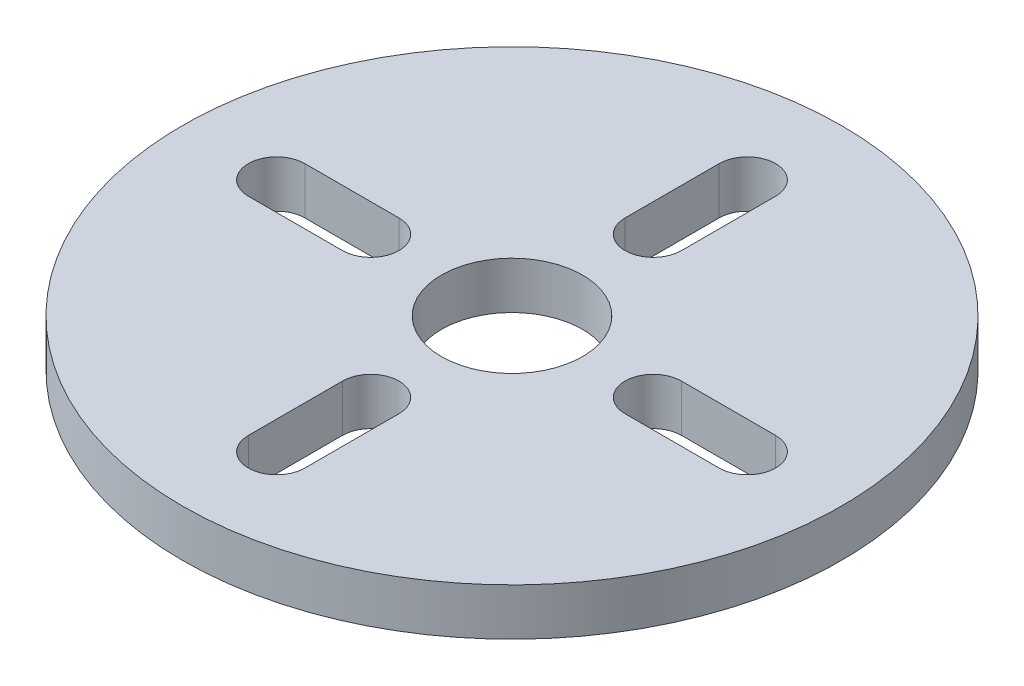
ISO-10303-21;
HEADER;
FILE_DESCRIPTION(('STEP AP214'),'2;1');
FILE_NAME('part.step','',(''),(''),'','','');
FILE_SCHEMA(('AUTOMOTIVE_DESIGN { 1 0 10303 214 1 1 1 1 }'));
ENDSEC;
DATA;
#1=APPLICATION_CONTEXT('core data for automotive mechanical design processes');
#2=APPLICATION_PROTOCOL_DEFINITION('international standard','automotive_design',2000,#1);
#3=PRODUCT_CONTEXT('',#1,'mechanical');
#4=PRODUCT('Part','Part','',(#3));
#5=PRODUCT_RELATED_PRODUCT_CATEGORY('part','',(#4));
#6=PRODUCT_DEFINITION_FORMATION('','',#4);
#7=PRODUCT_DEFINITION_CONTEXT('part definition',#1,'design');
#8=PRODUCT_DEFINITION('design','',#6,#7);
#9=PRODUCT_DEFINITION_SHAPE('','',#8);
#10=(LENGTH_UNIT() NAMED_UNIT(*) SI_UNIT(.MILLI.,.METRE.));
#11=(NAMED_UNIT(*) PLANE_ANGLE_UNIT() SI_UNIT($,.RADIAN.));
#12=(NAMED_UNIT(*) SI_UNIT($,.STERADIAN.) SOLID_ANGLE_UNIT());
#13=UNCERTAINTY_MEASURE_WITH_UNIT(LENGTH_MEASURE(1.E-05),#10,'distance_accuracy_value','');
#14=(GEOMETRIC_REPRESENTATION_CONTEXT(3) GLOBAL_UNCERTAINTY_ASSIGNED_CONTEXT((#13)) GLOBAL_UNIT_ASSIGNED_CONTEXT((#10,
#11,#12)) REPRESENTATION_CONTEXT('',''));
#15=CARTESIAN_POINT('',(0.,0.,0.));
#16=DIRECTION('',(0.,0.,1.));
#17=DIRECTION('',(1.,0.,0.));
#18=AXIS2_PLACEMENT_3D('',#15,#16,#17);
#19=CARTESIAN_POINT('',(0.,2.,0.));
#20=DIRECTION('',(0.,-1.,0.));
#21=DIRECTION('',(0.,0.,-1.));
#22=AXIS2_PLACEMENT_3D('',#19,#20,#21);
#23=CYLINDRICAL_SURFACE('',#22,14.);
#24=CARTESIAN_POINT('',(0.,2.,0.));
#25=DIRECTION('',(0.,1.,0.));
#26=DIRECTION('',(0.,0.,1.));
#27=AXIS2_PLACEMENT_3D('',#24,#25,#26);
#28=CIRCLE('',#27,14.);
#29=CARTESIAN_POINT('',(0.,2.,14.));
#30=VERTEX_POINT('',#29);
#31=EDGE_CURVE('E11',#30,#30,#28,.T.);
#32=ORIENTED_EDGE('',*,*,#31,.F.);
#33=EDGE_LOOP('',(#32));
#34=FACE_BOUND('',#33,.T.);
#35=CARTESIAN_POINT('',(0.,0.,0.));
#36=DIRECTION('',(0.,1.,0.));
#37=DIRECTION('',(0.,0.,1.));
#38=AXIS2_PLACEMENT_3D('',#35,#36,#37);
#39=CIRCLE('',#38,14.);
#40=CARTESIAN_POINT('',(0.,0.,14.));
#41=VERTEX_POINT('',#40);
#42=EDGE_CURVE('E38',#41,#41,#39,.T.);
#43=ORIENTED_EDGE('',*,*,#42,.T.);
#44=EDGE_LOOP('',(#43));
#45=FACE_BOUND('',#44,.T.);
#46=ADVANCED_FACE('F35',(#34,#45),#23,.T.);
#47=CARTESIAN_POINT('',(0.,2.,0.));
#48=DIRECTION('',(0.,1.,0.));
#49=DIRECTION('',(0.,0.,1.));
#50=AXIS2_PLACEMENT_3D('',#47,#48,#49);
#51=PLANE('',#50);
#52=CARTESIAN_POINT('',(-10.,2.,-1.02785005286658E-13));
#53=DIRECTION('',(0.,1.,0.));
#54=DIRECTION('',(0.,0.,1.));
#55=AXIS2_PLACEMENT_3D('',#52,#53,#54);
#56=CIRCLE('',#55,1.2);
#57=CARTESIAN_POINT('',(-9.99999999999972,2.,-1.19999999999972));
#58=VERTEX_POINT('',#57);
#59=CARTESIAN_POINT('',(-9.99999999999972,2.,1.20000000000028));
#60=VERTEX_POINT('',#59);
#61=EDGE_CURVE('E49',#58,#60,#56,.T.);
#62=ORIENTED_EDGE('',*,*,#61,.F.);
#63=DIRECTION('',(-1.,0.,0.));
#64=VECTOR('',#63,1.);
#65=CARTESIAN_POINT('',(-9.99999999999972,2.,-1.19999999999972));
#66=LINE('',#65,#64);
#67=CARTESIAN_POINT('',(-5.99999999999972,2.,-1.19999999999972));
#68=VERTEX_POINT('',#67);
#69=EDGE_CURVE('E192',#68,#58,#66,.T.);
#70=ORIENTED_EDGE('',*,*,#69,.F.);
#71=CARTESIAN_POINT('',(-6.,2.,0.));
#72=DIRECTION('',(0.,1.,0.));
#73=DIRECTION('',(0.,0.,1.));
#74=AXIS2_PLACEMENT_3D('',#71,#72,#73);
#75=CIRCLE('',#74,1.2);
#76=CARTESIAN_POINT('',(-5.99999999999972,2.,1.19999999999994));
#77=VERTEX_POINT('',#76);
#78=EDGE_CURVE('E206',#77,#68,#75,.T.);
#79=ORIENTED_EDGE('',*,*,#78,.F.);
#80=DIRECTION('',(1.,0.,0.));
#81=VECTOR('',#80,1.);
#82=CARTESIAN_POINT('',(-9.99999999999972,2.,1.20000000000028));
#83=LINE('',#82,#81);
#84=EDGE_CURVE('E203',#60,#77,#83,.T.);
#85=ORIENTED_EDGE('',*,*,#84,.F.);
#86=EDGE_LOOP('',(#62,#70,#79,#85));
#87=FACE_BOUND('',#86,.T.);
#88=CARTESIAN_POINT('',(0.,2.,10.));
#89=DIRECTION('',(0.,1.,0.));
#90=DIRECTION('',(0.,0.,1.));
#91=AXIS2_PLACEMENT_3D('',#88,#89,#90);
#92=CIRCLE('',#91,1.2);
#93=CARTESIAN_POINT('',(-1.19999999999944,2.,10.));
#94=VERTEX_POINT('',#93);
#95=CARTESIAN_POINT('',(1.20000000000056,2.,10.));
#96=VERTEX_POINT('',#95);
#97=EDGE_CURVE('E57',#94,#96,#92,.T.);
#98=ORIENTED_EDGE('',*,*,#97,.F.);
#99=DIRECTION('',(0.,0.,1.));
#100=VECTOR('',#99,1.);
#101=CARTESIAN_POINT('',(-1.19999999999944,2.,10.));
#102=LINE('',#101,#100);
#103=CARTESIAN_POINT('',(-1.19999999999944,2.,6.));
#104=VERTEX_POINT('',#103);
#105=EDGE_CURVE('E168',#104,#94,#102,.T.);
#106=ORIENTED_EDGE('',*,*,#105,.F.);
#107=CARTESIAN_POINT('',(0.,2.,6.));
#108=DIRECTION('',(0.,1.,0.));
#109=DIRECTION('',(0.,0.,1.));
#110=AXIS2_PLACEMENT_3D('',#107,#108,#109);
#111=CIRCLE('',#110,1.2);
#112=CARTESIAN_POINT('',(1.19999999999996,2.,6.));
#113=VERTEX_POINT('',#112);
#114=EDGE_CURVE('E171',#113,#104,#111,.T.);
#115=ORIENTED_EDGE('',*,*,#114,.F.);
#116=DIRECTION('',(0.,0.,-1.));
#117=VECTOR('',#116,1.);
#118=CARTESIAN_POINT('',(1.20000000000056,2.,10.));
#119=LINE('',#118,#117);
#120=EDGE_CURVE('E177',#96,#113,#119,.T.);
#121=ORIENTED_EDGE('',*,*,#120,.F.);
#122=EDGE_LOOP('',(#98,#106,#115,#121));
#123=FACE_BOUND('',#122,.T.);
#124=CARTESIAN_POINT('',(10.,2.,0.));
#125=DIRECTION('',(0.,1.,0.));
#126=DIRECTION('',(0.,0.,1.));
#127=AXIS2_PLACEMENT_3D('',#124,#125,#126);
#128=CIRCLE('',#127,1.2);
#129=CARTESIAN_POINT('',(10.0000000000003,2.,1.19999999999972));
#130=VERTEX_POINT('',#129);
#131=CARTESIAN_POINT('',(10.0000000000003,2.,-1.20000000000028));
#132=VERTEX_POINT('',#131);
#133=EDGE_CURVE('E184',#130,#132,#128,.T.);
#134=ORIENTED_EDGE('',*,*,#133,.F.);
#135=DIRECTION('',(1.,0.,0.));
#136=VECTOR('',#135,1.);
#137=CARTESIAN_POINT('',(10.0000000000003,2.,1.19999999999972));
#138=LINE('',#137,#136);
#139=CARTESIAN_POINT('',(6.00000000000028,2.,1.19999999999972));
#140=VERTEX_POINT('',#139);
#141=EDGE_CURVE('E229',#140,#130,#138,.T.);
#142=ORIENTED_EDGE('',*,*,#141,.F.);
#143=CARTESIAN_POINT('',(6.,2.,0.));
#144=DIRECTION('',(0.,1.,0.));
#145=DIRECTION('',(0.,0.,1.));
#146=AXIS2_PLACEMENT_3D('',#143,#144,#145);
#147=CIRCLE('',#146,1.2);
#148=CARTESIAN_POINT('',(6.00000000000028,2.,-1.19999999999998));
#149=VERTEX_POINT('',#148);
#150=EDGE_CURVE('E243',#149,#140,#147,.T.);
#151=ORIENTED_EDGE('',*,*,#150,.F.);
#152=DIRECTION('',(-1.,0.,0.));
#153=VECTOR('',#152,1.);
#154=CARTESIAN_POINT('',(10.0000000000003,2.,-1.20000000000028));
#155=LINE('',#154,#153);
#156=EDGE_CURVE('E240',#132,#149,#155,.T.);
#157=ORIENTED_EDGE('',*,*,#156,.F.);
#158=EDGE_LOOP('',(#134,#142,#151,#157));
#159=FACE_BOUND('',#158,.T.);
#160=CARTESIAN_POINT('',(0.,2.,0.));
#161=DIRECTION('',(0.,1.,0.));
#162=DIRECTION('',(0.,0.,1.));
#163=AXIS2_PLACEMENT_3D('',#160,#161,#162);
#164=CIRCLE('',#163,3.);
#165=CARTESIAN_POINT('',(0.,2.,3.));
#166=VERTEX_POINT('',#165);
#167=EDGE_CURVE('E221',#166,#166,#164,.T.);
#168=ORIENTED_EDGE('',*,*,#167,.F.);
#169=EDGE_LOOP('',(#168));
#170=FACE_BOUND('',#169,.T.);
#171=CARTESIAN_POINT('',(0.,2.,-10.));
#172=DIRECTION('',(0.,1.,0.));
#173=DIRECTION('',(0.,0.,1.));
#174=AXIS2_PLACEMENT_3D('',#171,#172,#173);
#175=CIRCLE('',#174,1.2);
#176=CARTESIAN_POINT('',(1.2,2.,-10.));
#177=VERTEX_POINT('',#176);
#178=CARTESIAN_POINT('',(-1.2,2.,-10.));
#179=VERTEX_POINT('',#178);
#180=EDGE_CURVE('E220',#177,#179,#175,.T.);
#181=ORIENTED_EDGE('',*,*,#180,.F.);
#182=DIRECTION('',(0.,0.,-1.));
#183=VECTOR('',#182,1.);
#184=CARTESIAN_POINT('',(1.2,2.,-10.));
#185=LINE('',#184,#183);
#186=CARTESIAN_POINT('',(1.2,2.,-6.));
#187=VERTEX_POINT('',#186);
#188=EDGE_CURVE('E259',#187,#177,#185,.T.);
#189=ORIENTED_EDGE('',*,*,#188,.F.);
#190=CARTESIAN_POINT('',(0.,2.,-6.));
#191=DIRECTION('',(0.,1.,0.));
#192=DIRECTION('',(0.,0.,1.));
#193=AXIS2_PLACEMENT_3D('',#190,#191,#192);
#194=CIRCLE('',#193,1.2);
#195=CARTESIAN_POINT('',(-1.2,2.,-6.));
#196=VERTEX_POINT('',#195);
#197=EDGE_CURVE('E273',#196,#187,#194,.T.);
#198=ORIENTED_EDGE('',*,*,#197,.F.);
#199=DIRECTION('',(0.,0.,1.));
#200=VECTOR('',#199,1.);
#201=CARTESIAN_POINT('',(-1.2,2.,-10.));
#202=LINE('',#201,#200);
#203=EDGE_CURVE('E270',#179,#196,#202,.T.);
#204=ORIENTED_EDGE('',*,*,#203,.F.);
#205=EDGE_LOOP('',(#181,#189,#198,#204));
#206=FACE_BOUND('',#205,.T.);
#207=ORIENTED_EDGE('',*,*,#31,.T.);
#208=EDGE_LOOP('',(#207));
#209=FACE_BOUND('',#208,.T.);
#210=ADVANCED_FACE('F295',(#87,#123,#159,#170,#206,#209),#51,.T.);
#211=CARTESIAN_POINT('',(0.,0.,0.));
#212=DIRECTION('',(0.,1.,0.));
#213=DIRECTION('',(0.,0.,1.));
#214=AXIS2_PLACEMENT_3D('',#211,#212,#213);
#215=PLANE('',#214);
#216=DIRECTION('',(-1.,0.,0.));
#217=VECTOR('',#216,1.);
#218=CARTESIAN_POINT('',(-9.99999999999972,0.,-1.19999999999972));
#219=LINE('',#218,#217);
#220=CARTESIAN_POINT('',(-5.99999999999972,0.,-1.19999999999972));
#221=VERTEX_POINT('',#220);
#222=CARTESIAN_POINT('',(-9.99999999999972,0.,-1.19999999999972));
#223=VERTEX_POINT('',#222);
#224=EDGE_CURVE('E198',#221,#223,#219,.T.);
#225=ORIENTED_EDGE('',*,*,#224,.T.);
#226=CARTESIAN_POINT('',(-10.,0.,-1.02785005286658E-13));
#227=DIRECTION('',(0.,1.,0.));
#228=DIRECTION('',(0.,0.,1.));
#229=AXIS2_PLACEMENT_3D('',#226,#227,#228);
#230=CIRCLE('',#229,1.2);
#231=CARTESIAN_POINT('',(-9.99999999999972,0.,1.20000000000028));
#232=VERTEX_POINT('',#231);
#233=EDGE_CURVE('E188',#223,#232,#230,.T.);
#234=ORIENTED_EDGE('',*,*,#233,.T.);
#235=DIRECTION('',(1.,0.,0.));
#236=VECTOR('',#235,1.);
#237=CARTESIAN_POINT('',(-9.99999999999972,0.,1.20000000000028));
#238=LINE('',#237,#236);
#239=CARTESIAN_POINT('',(-5.99999999999972,0.,1.20000000000028));
#240=VERTEX_POINT('',#239);
#241=EDGE_CURVE('E191',#232,#240,#238,.T.);
#242=ORIENTED_EDGE('',*,*,#241,.T.);
#243=CARTESIAN_POINT('',(-6.,0.,0.));
#244=DIRECTION('',(0.,1.,0.));
#245=DIRECTION('',(0.,0.,1.));
#246=AXIS2_PLACEMENT_3D('',#243,#244,#245);
#247=CIRCLE('',#246,1.2);
#248=EDGE_CURVE('E195',#240,#221,#247,.T.);
#249=ORIENTED_EDGE('',*,*,#248,.T.);
#250=EDGE_LOOP('',(#225,#234,#242,#249));
#251=FACE_BOUND('',#250,.T.);
#252=DIRECTION('',(0.,0.,1.));
#253=VECTOR('',#252,1.);
#254=CARTESIAN_POINT('',(-1.19999999999944,0.,10.));
#255=LINE('',#254,#253);
#256=CARTESIAN_POINT('',(-1.19999999999944,0.,6.));
#257=VERTEX_POINT('',#256);
#258=CARTESIAN_POINT('',(-1.19999999999944,0.,10.));
#259=VERTEX_POINT('',#258);
#260=EDGE_CURVE('E155',#257,#259,#255,.T.);
#261=ORIENTED_EDGE('',*,*,#260,.T.);
#262=CARTESIAN_POINT('',(0.,0.,10.));
#263=DIRECTION('',(0.,1.,0.));
#264=DIRECTION('',(0.,0.,1.));
#265=AXIS2_PLACEMENT_3D('',#262,#263,#264);
#266=CIRCLE('',#265,1.2);
#267=CARTESIAN_POINT('',(1.20000000000056,0.,10.));
#268=VERTEX_POINT('',#267);
#269=EDGE_CURVE('E149',#259,#268,#266,.T.);
#270=ORIENTED_EDGE('',*,*,#269,.T.);
#271=DIRECTION('',(0.,0.,-1.));
#272=VECTOR('',#271,1.);
#273=CARTESIAN_POINT('',(1.20000000000056,0.,10.));
#274=LINE('',#273,#272);
#275=CARTESIAN_POINT('',(1.20000000000056,0.,6.));
#276=VERTEX_POINT('',#275);
#277=EDGE_CURVE('E159',#268,#276,#274,.T.);
#278=ORIENTED_EDGE('',*,*,#277,.T.);
#279=CARTESIAN_POINT('',(0.,0.,6.));
#280=DIRECTION('',(0.,1.,0.));
#281=DIRECTION('',(0.,0.,1.));
#282=AXIS2_PLACEMENT_3D('',#279,#280,#281);
#283=CIRCLE('',#282,1.2);
#284=EDGE_CURVE('E163',#276,#257,#283,.T.);
#285=ORIENTED_EDGE('',*,*,#284,.T.);
#286=EDGE_LOOP('',(#261,#270,#278,#285));
#287=FACE_BOUND('',#286,.T.);
#288=DIRECTION('',(1.,0.,0.));
#289=VECTOR('',#288,1.);
#290=CARTESIAN_POINT('',(10.0000000000003,0.,1.19999999999972));
#291=LINE('',#290,#289);
#292=CARTESIAN_POINT('',(6.00000000000028,0.,1.19999999999972));
#293=VERTEX_POINT('',#292);
#294=CARTESIAN_POINT('',(10.0000000000003,0.,1.19999999999972));
#295=VERTEX_POINT('',#294);
#296=EDGE_CURVE('E235',#293,#295,#291,.T.);
#297=ORIENTED_EDGE('',*,*,#296,.T.);
#298=CARTESIAN_POINT('',(10.,0.,0.));
#299=DIRECTION('',(0.,1.,0.));
#300=DIRECTION('',(0.,0.,1.));
#301=AXIS2_PLACEMENT_3D('',#298,#299,#300);
#302=CIRCLE('',#301,1.2);
#303=CARTESIAN_POINT('',(10.0000000000003,0.,-1.20000000000028));
#304=VERTEX_POINT('',#303);
#305=EDGE_CURVE('E225',#295,#304,#302,.T.);
#306=ORIENTED_EDGE('',*,*,#305,.T.);
#307=DIRECTION('',(-1.,0.,0.));
#308=VECTOR('',#307,1.);
#309=CARTESIAN_POINT('',(10.0000000000003,0.,-1.20000000000028));
#310=LINE('',#309,#308);
#311=CARTESIAN_POINT('',(6.00000000000028,0.,-1.20000000000028));
#312=VERTEX_POINT('',#311);
#313=EDGE_CURVE('E228',#304,#312,#310,.T.);
#314=ORIENTED_EDGE('',*,*,#313,.T.);
#315=CARTESIAN_POINT('',(6.,0.,0.));
#316=DIRECTION('',(0.,1.,0.));
#317=DIRECTION('',(0.,0.,1.));
#318=AXIS2_PLACEMENT_3D('',#315,#316,#317);
#319=CIRCLE('',#318,1.2);
#320=EDGE_CURVE('E232',#312,#293,#319,.T.);
#321=ORIENTED_EDGE('',*,*,#320,.T.);
#322=EDGE_LOOP('',(#297,#306,#314,#321));
#323=FACE_BOUND('',#322,.T.);
#324=CARTESIAN_POINT('',(0.,0.,0.));
#325=DIRECTION('',(0.,1.,0.));
#326=DIRECTION('',(0.,0.,1.));
#327=AXIS2_PLACEMENT_3D('',#324,#325,#326);
#328=CIRCLE('',#327,3.);
#329=CARTESIAN_POINT('',(0.,0.,3.));
#330=VERTEX_POINT('',#329);
#331=EDGE_CURVE('E217',#330,#330,#328,.T.);
#332=ORIENTED_EDGE('',*,*,#331,.T.);
#333=EDGE_LOOP('',(#332));
#334=FACE_BOUND('',#333,.T.);
#335=DIRECTION('',(0.,0.,-1.));
#336=VECTOR('',#335,1.);
#337=CARTESIAN_POINT('',(1.2,0.,-10.));
#338=LINE('',#337,#336);
#339=CARTESIAN_POINT('',(1.2,0.,-6.));
#340=VERTEX_POINT('',#339);
#341=CARTESIAN_POINT('',(1.2,0.,-10.));
#342=VERTEX_POINT('',#341);
#343=EDGE_CURVE('E265',#340,#342,#338,.T.);
#344=ORIENTED_EDGE('',*,*,#343,.T.);
#345=CARTESIAN_POINT('',(0.,0.,-10.));
#346=DIRECTION('',(0.,1.,0.));
#347=DIRECTION('',(0.,0.,1.));
#348=AXIS2_PLACEMENT_3D('',#345,#346,#347);
#349=CIRCLE('',#348,1.2);
#350=CARTESIAN_POINT('',(-1.2,0.,-10.));
#351=VERTEX_POINT('',#350);
#352=EDGE_CURVE('E255',#342,#351,#349,.T.);
#353=ORIENTED_EDGE('',*,*,#352,.T.);
#354=DIRECTION('',(0.,0.,1.));
#355=VECTOR('',#354,1.);
#356=CARTESIAN_POINT('',(-1.2,0.,-10.));
#357=LINE('',#356,#355);
#358=CARTESIAN_POINT('',(-1.2,0.,-6.));
#359=VERTEX_POINT('',#358);
#360=EDGE_CURVE('E258',#351,#359,#357,.T.);
#361=ORIENTED_EDGE('',*,*,#360,.T.);
#362=CARTESIAN_POINT('',(0.,0.,-6.));
#363=DIRECTION('',(0.,1.,0.));
#364=DIRECTION('',(0.,0.,1.));
#365=AXIS2_PLACEMENT_3D('',#362,#363,#364);
#366=CIRCLE('',#365,1.2);
#367=EDGE_CURVE('E262',#359,#340,#366,.T.);
#368=ORIENTED_EDGE('',*,*,#367,.T.);
#369=EDGE_LOOP('',(#344,#353,#361,#368));
#370=FACE_BOUND('',#369,.T.);
#371=ORIENTED_EDGE('',*,*,#42,.F.);
#372=EDGE_LOOP('',(#371));
#373=FACE_BOUND('',#372,.T.);
#374=ADVANCED_FACE('F165',(#251,#287,#323,#334,#370,#373),#215,.F.);
#375=CARTESIAN_POINT('',(0.,0.,-10.));
#376=DIRECTION('',(0.,1.,0.));
#377=DIRECTION('',(0.,0.,1.));
#378=AXIS2_PLACEMENT_3D('',#375,#376,#377);
#379=CYLINDRICAL_SURFACE('',#378,1.2);
#380=ORIENTED_EDGE('',*,*,#180,.T.);
#381=DIRECTION('',(0.,1.,0.));
#382=VECTOR('',#381,1.);
#383=CARTESIAN_POINT('',(-1.2,0.,-10.));
#384=LINE('',#383,#382);
#385=EDGE_CURVE('E268',#351,#179,#384,.T.);
#386=ORIENTED_EDGE('',*,*,#385,.F.);
#387=ORIENTED_EDGE('',*,*,#352,.F.);
#388=DIRECTION('',(0.,1.,0.));
#389=VECTOR('',#388,1.);
#390=CARTESIAN_POINT('',(1.2,0.,-10.));
#391=LINE('',#390,#389);
#392=EDGE_CURVE('E278',#342,#177,#391,.T.);
#393=ORIENTED_EDGE('',*,*,#392,.T.);
#394=EDGE_LOOP('',(#380,#386,#387,#393));
#395=FACE_BOUND('',#394,.T.);
#396=ADVANCED_FACE('F303',(#395),#379,.F.);
#397=CARTESIAN_POINT('',(1.2,0.,-10.));
#398=DIRECTION('',(1.,0.,0.));
#399=DIRECTION('',(0.,0.,-1.));
#400=AXIS2_PLACEMENT_3D('',#397,#398,#399);
#401=PLANE('',#400);
#402=ORIENTED_EDGE('',*,*,#188,.T.);
#403=ORIENTED_EDGE('',*,*,#392,.F.);
#404=ORIENTED_EDGE('',*,*,#343,.F.);
#405=DIRECTION('',(0.,1.,0.));
#406=VECTOR('',#405,1.);
#407=CARTESIAN_POINT('',(1.2,0.,-6.));
#408=LINE('',#407,#406);
#409=EDGE_CURVE('E280',#340,#187,#408,.T.);
#410=ORIENTED_EDGE('',*,*,#409,.T.);
#411=EDGE_LOOP('',(#402,#403,#404,#410));
#412=FACE_BOUND('',#411,.T.);
#413=ADVANCED_FACE('F305',(#412),#401,.F.);
#414=CARTESIAN_POINT('',(0.,0.,-6.));
#415=DIRECTION('',(0.,1.,0.));
#416=DIRECTION('',(0.,0.,1.));
#417=AXIS2_PLACEMENT_3D('',#414,#415,#416);
#418=CYLINDRICAL_SURFACE('',#417,1.2);
#419=ORIENTED_EDGE('',*,*,#197,.T.);
#420=ORIENTED_EDGE('',*,*,#409,.F.);
#421=ORIENTED_EDGE('',*,*,#367,.F.);
#422=DIRECTION('',(0.,1.,0.));
#423=VECTOR('',#422,1.);
#424=CARTESIAN_POINT('',(-1.2,0.,-6.));
#425=LINE('',#424,#423);
#426=EDGE_CURVE('E282',#359,#196,#425,.T.);
#427=ORIENTED_EDGE('',*,*,#426,.T.);
#428=EDGE_LOOP('',(#419,#420,#421,#427));
#429=FACE_BOUND('',#428,.T.);
#430=ADVANCED_FACE('F299',(#429),#418,.F.);
#431=CARTESIAN_POINT('',(-1.2,0.,-10.));
#432=DIRECTION('',(-1.,0.,0.));
#433=DIRECTION('',(0.,0.,1.));
#434=AXIS2_PLACEMENT_3D('',#431,#432,#433);
#435=PLANE('',#434);
#436=ORIENTED_EDGE('',*,*,#203,.T.);
#437=ORIENTED_EDGE('',*,*,#426,.F.);
#438=ORIENTED_EDGE('',*,*,#360,.F.);
#439=ORIENTED_EDGE('',*,*,#385,.T.);
#440=EDGE_LOOP('',(#436,#437,#438,#439));
#441=FACE_BOUND('',#440,.T.);
#442=ADVANCED_FACE('F288',(#441),#435,.F.);
#443=CARTESIAN_POINT('',(0.,0.,0.));
#444=DIRECTION('',(0.,1.,0.));
#445=DIRECTION('',(0.,0.,1.));
#446=AXIS2_PLACEMENT_3D('',#443,#444,#445);
#447=CYLINDRICAL_SURFACE('',#446,3.);
#448=ORIENTED_EDGE('',*,*,#331,.F.);
#449=EDGE_LOOP('',(#448));
#450=FACE_BOUND('',#449,.T.);
#451=ORIENTED_EDGE('',*,*,#167,.T.);
#452=EDGE_LOOP('',(#451));
#453=FACE_BOUND('',#452,.T.);
#454=ADVANCED_FACE('F332',(#450,#453),#447,.F.);
#455=CARTESIAN_POINT('',(10.,0.,0.));
#456=DIRECTION('',(0.,1.,0.));
#457=DIRECTION('',(0.,0.,1.));
#458=AXIS2_PLACEMENT_3D('',#455,#456,#457);
#459=CYLINDRICAL_SURFACE('',#458,1.2);
#460=ORIENTED_EDGE('',*,*,#133,.T.);
#461=DIRECTION('',(0.,1.,0.));
#462=VECTOR('',#461,1.);
#463=CARTESIAN_POINT('',(10.0000000000003,0.,-1.20000000000028));
#464=LINE('',#463,#462);
#465=EDGE_CURVE('E238',#304,#132,#464,.T.);
#466=ORIENTED_EDGE('',*,*,#465,.F.);
#467=ORIENTED_EDGE('',*,*,#305,.F.);
#468=DIRECTION('',(0.,1.,0.));
#469=VECTOR('',#468,1.);
#470=CARTESIAN_POINT('',(10.0000000000003,0.,1.19999999999972));
#471=LINE('',#470,#469);
#472=EDGE_CURVE('E224',#295,#130,#471,.T.);
#473=ORIENTED_EDGE('',*,*,#472,.T.);
#474=EDGE_LOOP('',(#460,#466,#467,#473));
#475=FACE_BOUND('',#474,.T.);
#476=ADVANCED_FACE('F336',(#475),#459,.F.);
#477=CARTESIAN_POINT('',(10.0000000000003,0.,1.19999999999972));
#478=DIRECTION('',(0.,0.,1.));
#479=DIRECTION('',(1.,0.,0.));
#480=AXIS2_PLACEMENT_3D('',#477,#478,#479);
#481=PLANE('',#480);
#482=ORIENTED_EDGE('',*,*,#141,.T.);
#483=ORIENTED_EDGE('',*,*,#472,.F.);
#484=ORIENTED_EDGE('',*,*,#296,.F.);
#485=DIRECTION('',(0.,1.,0.));
#486=VECTOR('',#485,1.);
#487=CARTESIAN_POINT('',(6.00000000000028,0.,1.19999999999972));
#488=LINE('',#487,#486);
#489=EDGE_CURVE('E249',#293,#140,#488,.T.);
#490=ORIENTED_EDGE('',*,*,#489,.T.);
#491=EDGE_LOOP('',(#482,#483,#484,#490));
#492=FACE_BOUND('',#491,.T.);
#493=ADVANCED_FACE('F342',(#492),#481,.F.);
#494=CARTESIAN_POINT('',(6.,0.,0.));
#495=DIRECTION('',(0.,1.,0.));
#496=DIRECTION('',(0.,0.,1.));
#497=AXIS2_PLACEMENT_3D('',#494,#495,#496);
#498=CYLINDRICAL_SURFACE('',#497,1.2);
#499=ORIENTED_EDGE('',*,*,#150,.T.);
#500=ORIENTED_EDGE('',*,*,#489,.F.);
#501=ORIENTED_EDGE('',*,*,#320,.F.);
#502=DIRECTION('',(0.,1.,0.));
#503=VECTOR('',#502,1.);
#504=CARTESIAN_POINT('',(6.00000000000028,0.,-1.19999999999998));
#505=LINE('',#504,#503);
#506=EDGE_CURVE('E251',#312,#149,#505,.T.);
#507=ORIENTED_EDGE('',*,*,#506,.T.);
#508=EDGE_LOOP('',(#499,#500,#501,#507));
#509=FACE_BOUND('',#508,.T.);
#510=ADVANCED_FACE('F352',(#509),#498,.F.);
#511=CARTESIAN_POINT('',(10.0000000000003,0.,-1.20000000000028));
#512=DIRECTION('',(0.,0.,-1.));
#513=DIRECTION('',(-1.,0.,0.));
#514=AXIS2_PLACEMENT_3D('',#511,#512,#513);
#515=PLANE('',#514);
#516=ORIENTED_EDGE('',*,*,#156,.T.);
#517=ORIENTED_EDGE('',*,*,#506,.F.);
#518=ORIENTED_EDGE('',*,*,#313,.F.);
#519=ORIENTED_EDGE('',*,*,#465,.T.);
#520=EDGE_LOOP('',(#516,#517,#518,#519));
#521=FACE_BOUND('',#520,.T.);
#522=ADVANCED_FACE('F356',(#521),#515,.F.);
#523=CARTESIAN_POINT('',(0.,0.,10.));
#524=DIRECTION('',(0.,1.,0.));
#525=DIRECTION('',(0.,0.,1.));
#526=AXIS2_PLACEMENT_3D('',#523,#524,#525);
#527=CYLINDRICAL_SURFACE('',#526,1.2);
#528=ORIENTED_EDGE('',*,*,#97,.T.);
#529=DIRECTION('',(0.,1.,0.));
#530=VECTOR('',#529,1.);
#531=CARTESIAN_POINT('',(1.20000000000056,0.,10.));
#532=LINE('',#531,#530);
#533=EDGE_CURVE('E145',#268,#96,#532,.T.);
#534=ORIENTED_EDGE('',*,*,#533,.F.);
#535=ORIENTED_EDGE('',*,*,#269,.F.);
#536=DIRECTION('',(0.,1.,0.));
#537=VECTOR('',#536,1.);
#538=CARTESIAN_POINT('',(-1.19999999999944,0.,10.));
#539=LINE('',#538,#537);
#540=EDGE_CURVE('E182',#259,#94,#539,.T.);
#541=ORIENTED_EDGE('',*,*,#540,.T.);
#542=EDGE_LOOP('',(#528,#534,#535,#541));
#543=FACE_BOUND('',#542,.T.);
#544=ADVANCED_FACE('F147',(#543),#527,.F.);
#545=CARTESIAN_POINT('',(-1.19999999999944,0.,10.));
#546=DIRECTION('',(-1.,0.,0.));
#547=DIRECTION('',(0.,0.,1.));
#548=AXIS2_PLACEMENT_3D('',#545,#546,#547);
#549=PLANE('',#548);
#550=ORIENTED_EDGE('',*,*,#105,.T.);
#551=ORIENTED_EDGE('',*,*,#540,.F.);
#552=ORIENTED_EDGE('',*,*,#260,.F.);
#553=DIRECTION('',(0.,1.,0.));
#554=VECTOR('',#553,1.);
#555=CARTESIAN_POINT('',(-1.19999999999944,0.,6.));
#556=LINE('',#555,#554);
#557=EDGE_CURVE('E185',#257,#104,#556,.T.);
#558=ORIENTED_EDGE('',*,*,#557,.T.);
#559=EDGE_LOOP('',(#550,#551,#552,#558));
#560=FACE_BOUND('',#559,.T.);
#561=ADVANCED_FACE('F363',(#560),#549,.F.);
#562=CARTESIAN_POINT('',(0.,0.,6.));
#563=DIRECTION('',(0.,1.,0.));
#564=DIRECTION('',(0.,0.,1.));
#565=AXIS2_PLACEMENT_3D('',#562,#563,#564);
#566=CYLINDRICAL_SURFACE('',#565,1.2);
#567=ORIENTED_EDGE('',*,*,#114,.T.);
#568=ORIENTED_EDGE('',*,*,#557,.F.);
#569=ORIENTED_EDGE('',*,*,#284,.F.);
#570=DIRECTION('',(0.,1.,0.));
#571=VECTOR('',#570,1.);
#572=CARTESIAN_POINT('',(1.19999999999996,0.,6.));
#573=LINE('',#572,#571);
#574=EDGE_CURVE('E154',#276,#113,#573,.T.);
#575=ORIENTED_EDGE('',*,*,#574,.T.);
#576=EDGE_LOOP('',(#567,#568,#569,#575));
#577=FACE_BOUND('',#576,.T.);
#578=ADVANCED_FACE('F380',(#577),#566,.F.);
#579=CARTESIAN_POINT('',(1.20000000000056,0.,10.));
#580=DIRECTION('',(1.,0.,0.));
#581=DIRECTION('',(0.,0.,-1.));
#582=AXIS2_PLACEMENT_3D('',#579,#580,#581);
#583=PLANE('',#582);
#584=ORIENTED_EDGE('',*,*,#120,.T.);
#585=ORIENTED_EDGE('',*,*,#574,.F.);
#586=ORIENTED_EDGE('',*,*,#277,.F.);
#587=ORIENTED_EDGE('',*,*,#533,.T.);
#588=EDGE_LOOP('',(#584,#585,#586,#587));
#589=FACE_BOUND('',#588,.T.);
#590=ADVANCED_FACE('F160',(#589),#583,.F.);
#591=CARTESIAN_POINT('',(-10.,0.,-1.02785005286658E-13));
#592=DIRECTION('',(0.,1.,0.));
#593=DIRECTION('',(0.,0.,1.));
#594=AXIS2_PLACEMENT_3D('',#591,#592,#593);
#595=CYLINDRICAL_SURFACE('',#594,1.2);
#596=ORIENTED_EDGE('',*,*,#61,.T.);
#597=DIRECTION('',(0.,1.,0.));
#598=VECTOR('',#597,1.);
#599=CARTESIAN_POINT('',(-9.99999999999972,0.,1.20000000000028));
#600=LINE('',#599,#598);
#601=EDGE_CURVE('E201',#232,#60,#600,.T.);
#602=ORIENTED_EDGE('',*,*,#601,.F.);
#603=ORIENTED_EDGE('',*,*,#233,.F.);
#604=DIRECTION('',(0.,1.,0.));
#605=VECTOR('',#604,1.);
#606=CARTESIAN_POINT('',(-9.99999999999972,0.,-1.19999999999972));
#607=LINE('',#606,#605);
#608=EDGE_CURVE('E178',#223,#58,#607,.T.);
#609=ORIENTED_EDGE('',*,*,#608,.T.);
#610=EDGE_LOOP('',(#596,#602,#603,#609));
#611=FACE_BOUND('',#610,.T.);
#612=ADVANCED_FACE('F348',(#611),#595,.F.);
#613=CARTESIAN_POINT('',(-9.99999999999972,0.,-1.19999999999972));
#614=DIRECTION('',(0.,0.,-1.));
#615=DIRECTION('',(-1.,0.,0.));
#616=AXIS2_PLACEMENT_3D('',#613,#614,#615);
#617=PLANE('',#616);
#618=ORIENTED_EDGE('',*,*,#69,.T.);
#619=ORIENTED_EDGE('',*,*,#608,.F.);
#620=ORIENTED_EDGE('',*,*,#224,.F.);
#621=DIRECTION('',(0.,1.,0.));
#622=VECTOR('',#621,1.);
#623=CARTESIAN_POINT('',(-5.99999999999972,0.,-1.19999999999972));
#624=LINE('',#623,#622);
#625=EDGE_CURVE('E212',#221,#68,#624,.T.);
#626=ORIENTED_EDGE('',*,*,#625,.T.);
#627=EDGE_LOOP('',(#618,#619,#620,#626));
#628=FACE_BOUND('',#627,.T.);
#629=ADVANCED_FACE('F386',(#628),#617,.F.);
#630=CARTESIAN_POINT('',(-6.,0.,0.));
#631=DIRECTION('',(0.,1.,0.));
#632=DIRECTION('',(0.,0.,1.));
#633=AXIS2_PLACEMENT_3D('',#630,#631,#632);
#634=CYLINDRICAL_SURFACE('',#633,1.2);
#635=ORIENTED_EDGE('',*,*,#78,.T.);
#636=ORIENTED_EDGE('',*,*,#625,.F.);
#637=ORIENTED_EDGE('',*,*,#248,.F.);
#638=DIRECTION('',(0.,1.,0.));
#639=VECTOR('',#638,1.);
#640=CARTESIAN_POINT('',(-5.99999999999972,0.,1.19999999999994));
#641=LINE('',#640,#639);
#642=EDGE_CURVE('E214',#240,#77,#641,.T.);
#643=ORIENTED_EDGE('',*,*,#642,.T.);
#644=EDGE_LOOP('',(#635,#636,#637,#643));
#645=FACE_BOUND('',#644,.T.);
#646=ADVANCED_FACE('F389',(#645),#634,.F.);
#647=CARTESIAN_POINT('',(-9.99999999999972,0.,1.20000000000028));
#648=DIRECTION('',(0.,0.,1.));
#649=DIRECTION('',(1.,0.,0.));
#650=AXIS2_PLACEMENT_3D('',#647,#648,#649);
#651=PLANE('',#650);
#652=ORIENTED_EDGE('',*,*,#84,.T.);
#653=ORIENTED_EDGE('',*,*,#642,.F.);
#654=ORIENTED_EDGE('',*,*,#241,.F.);
#655=ORIENTED_EDGE('',*,*,#601,.T.);
#656=EDGE_LOOP('',(#652,#653,#654,#655));
#657=FACE_BOUND('',#656,.T.);
#658=ADVANCED_FACE('F392',(#657),#651,.F.);
#659=CLOSED_SHELL('',(#46,#210,#374,#396,#413,#430,#442,#454,#476,#493,#510,#522,#544,#561,#578,
#590,#612,#629,#646,#658));
#660=MANIFOLD_SOLID_BREP('B2',#659);
#661=ADVANCED_BREP_SHAPE_REPRESENTATION('',(#18,#660),#14);
#662=SHAPE_DEFINITION_REPRESENTATION(#9,#661);
ENDSEC;
END-ISO-10303-21;
